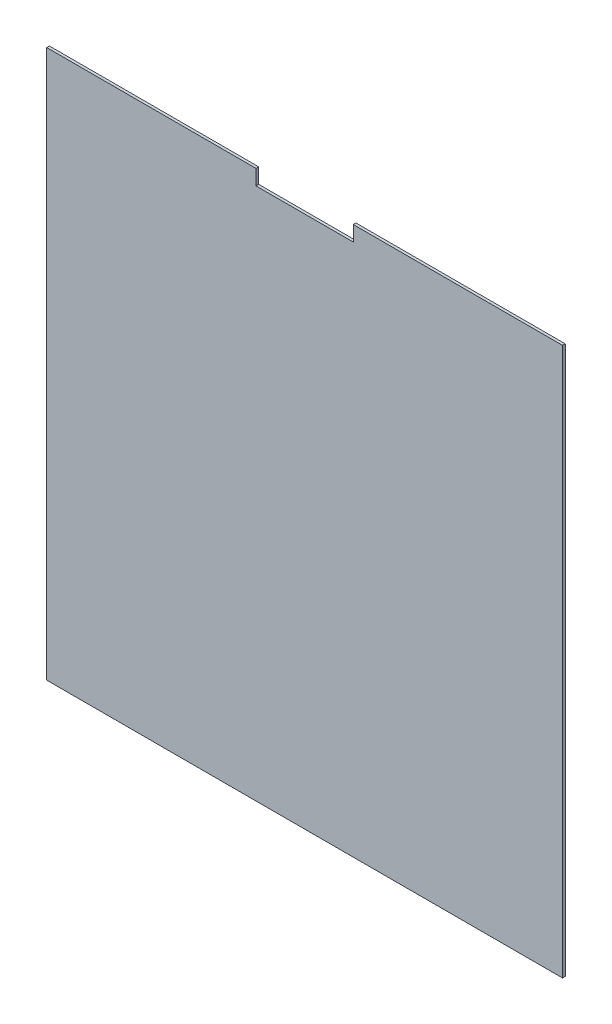
ISO-10303-21;
HEADER;
FILE_DESCRIPTION(('STEP AP214'),'2;1');
FILE_NAME('part.step','',(''),(''),'','','');
FILE_SCHEMA(('AUTOMOTIVE_DESIGN { 1 0 10303 214 1 1 1 1 }'));
ENDSEC;
DATA;
#1=APPLICATION_CONTEXT('core data for automotive mechanical design processes');
#2=APPLICATION_PROTOCOL_DEFINITION('international standard','automotive_design',2000,#1);
#3=PRODUCT_CONTEXT('',#1,'mechanical');
#4=PRODUCT('Part','Part','',(#3));
#5=PRODUCT_RELATED_PRODUCT_CATEGORY('part','',(#4));
#6=PRODUCT_DEFINITION_FORMATION('','',#4);
#7=PRODUCT_DEFINITION_CONTEXT('part definition',#1,'design');
#8=PRODUCT_DEFINITION('design','',#6,#7);
#9=PRODUCT_DEFINITION_SHAPE('','',#8);
#10=(LENGTH_UNIT() NAMED_UNIT(*) SI_UNIT(.MILLI.,.METRE.));
#11=(NAMED_UNIT(*) PLANE_ANGLE_UNIT() SI_UNIT($,.RADIAN.));
#12=(NAMED_UNIT(*) SI_UNIT($,.STERADIAN.) SOLID_ANGLE_UNIT());
#13=UNCERTAINTY_MEASURE_WITH_UNIT(LENGTH_MEASURE(1.E-05),#10,'distance_accuracy_value','');
#14=(GEOMETRIC_REPRESENTATION_CONTEXT(3) GLOBAL_UNCERTAINTY_ASSIGNED_CONTEXT((#13)) GLOBAL_UNIT_ASSIGNED_CONTEXT((#10,
#11,#12)) REPRESENTATION_CONTEXT('',''));
#15=CARTESIAN_POINT('',(0.,0.,0.));
#16=DIRECTION('',(0.,0.,1.));
#17=DIRECTION('',(1.,0.,0.));
#18=AXIS2_PLACEMENT_3D('',#15,#16,#17);
#19=CARTESIAN_POINT('',(22.0000000000001,198.766085175521,3.));
#20=DIRECTION('',(0.,1.,0.));
#21=DIRECTION('',(0.,0.,1.));
#22=AXIS2_PLACEMENT_3D('',#19,#20,#21);
#23=PLANE('',#22);
#24=DIRECTION('',(-1.,0.,0.));
#25=VECTOR('',#24,1.);
#26=CARTESIAN_POINT('',(22.0000000000001,198.766085175521,5.));
#27=LINE('',#26,#25);
#28=CARTESIAN_POINT('',(22.0000000000001,198.766085175521,5.));
#29=VERTEX_POINT('',#28);
#30=CARTESIAN_POINT('',(-50.,198.766085175521,5.));
#31=VERTEX_POINT('',#30);
#32=EDGE_CURVE('E137',#29,#31,#27,.T.);
#33=ORIENTED_EDGE('',*,*,#32,.F.);
#34=DIRECTION('',(0.,0.,1.));
#35=VECTOR('',#34,1.);
#36=CARTESIAN_POINT('',(22.0000000000001,198.766085175521,3.));
#37=LINE('',#36,#35);
#38=CARTESIAN_POINT('',(22.0000000000001,198.766085175521,3.));
#39=VERTEX_POINT('',#38);
#40=EDGE_CURVE('E11',#39,#29,#37,.T.);
#41=ORIENTED_EDGE('',*,*,#40,.F.);
#42=DIRECTION('',(-1.,0.,0.));
#43=VECTOR('',#42,1.);
#44=CARTESIAN_POINT('',(22.0000000000001,198.766085175521,3.));
#45=LINE('',#44,#43);
#46=CARTESIAN_POINT('',(-50.,198.766085175521,3.));
#47=VERTEX_POINT('',#46);
#48=EDGE_CURVE('E154',#39,#47,#45,.T.);
#49=ORIENTED_EDGE('',*,*,#48,.T.);
#50=DIRECTION('',(0.,0.,1.));
#51=VECTOR('',#50,1.);
#52=CARTESIAN_POINT('',(-50.,198.766085175521,3.));
#53=LINE('',#52,#51);
#54=EDGE_CURVE('E44',#47,#31,#53,.T.);
#55=ORIENTED_EDGE('',*,*,#54,.T.);
#56=EDGE_LOOP('',(#33,#41,#49,#55));
#57=FACE_BOUND('',#56,.T.);
#58=ADVANCED_FACE('F41',(#57),#23,.T.);
#59=CARTESIAN_POINT('',(22.0000000000001,210.,3.));
#60=DIRECTION('',(-1.,0.,0.));
#61=DIRECTION('',(0.,0.,1.));
#62=AXIS2_PLACEMENT_3D('',#59,#60,#61);
#63=PLANE('',#62);
#64=DIRECTION('',(0.,-1.,0.));
#65=VECTOR('',#64,1.);
#66=CARTESIAN_POINT('',(22.0000000000001,210.,5.));
#67=LINE('',#66,#65);
#68=CARTESIAN_POINT('',(22.0000000000001,210.,5.));
#69=VERTEX_POINT('',#68);
#70=EDGE_CURVE('E152',#69,#29,#67,.T.);
#71=ORIENTED_EDGE('',*,*,#70,.F.);
#72=DIRECTION('',(0.,0.,1.));
#73=VECTOR('',#72,1.);
#74=CARTESIAN_POINT('',(22.0000000000001,210.,3.));
#75=LINE('',#74,#73);
#76=CARTESIAN_POINT('',(22.0000000000001,210.,3.));
#77=VERTEX_POINT('',#76);
#78=EDGE_CURVE('E49',#77,#69,#75,.T.);
#79=ORIENTED_EDGE('',*,*,#78,.F.);
#80=DIRECTION('',(0.,-1.,0.));
#81=VECTOR('',#80,1.);
#82=CARTESIAN_POINT('',(22.0000000000001,210.,3.));
#83=LINE('',#82,#81);
#84=EDGE_CURVE('E132',#77,#39,#83,.T.);
#85=ORIENTED_EDGE('',*,*,#84,.T.);
#86=ORIENTED_EDGE('',*,*,#40,.T.);
#87=EDGE_LOOP('',(#71,#79,#85,#86));
#88=FACE_BOUND('',#87,.T.);
#89=ADVANCED_FACE('F162',(#88),#63,.T.);
#90=CARTESIAN_POINT('',(177.,210.,3.));
#91=DIRECTION('',(0.,1.,0.));
#92=DIRECTION('',(-1.,0.,0.));
#93=AXIS2_PLACEMENT_3D('',#90,#91,#92);
#94=PLANE('',#93);
#95=DIRECTION('',(-1.,0.,0.));
#96=VECTOR('',#95,1.);
#97=CARTESIAN_POINT('',(177.,210.,5.));
#98=LINE('',#97,#96);
#99=CARTESIAN_POINT('',(177.,210.,5.));
#100=VERTEX_POINT('',#99);
#101=EDGE_CURVE('E128',#100,#69,#98,.T.);
#102=ORIENTED_EDGE('',*,*,#101,.F.);
#103=DIRECTION('',(0.,0.,1.));
#104=VECTOR('',#103,1.);
#105=CARTESIAN_POINT('',(177.,210.,3.));
#106=LINE('',#105,#104);
#107=CARTESIAN_POINT('',(177.,210.,3.));
#108=VERTEX_POINT('',#107);
#109=EDGE_CURVE('E114',#108,#100,#106,.T.);
#110=ORIENTED_EDGE('',*,*,#109,.F.);
#111=DIRECTION('',(-1.,0.,0.));
#112=VECTOR('',#111,1.);
#113=CARTESIAN_POINT('',(177.,210.,3.));
#114=LINE('',#113,#112);
#115=EDGE_CURVE('E120',#108,#77,#114,.T.);
#116=ORIENTED_EDGE('',*,*,#115,.T.);
#117=ORIENTED_EDGE('',*,*,#78,.T.);
#118=EDGE_LOOP('',(#102,#110,#116,#117));
#119=FACE_BOUND('',#118,.T.);
#120=ADVANCED_FACE('F125',(#119),#94,.T.);
#121=CARTESIAN_POINT('',(177.,-225.,3.));
#122=DIRECTION('',(1.,0.,0.));
#123=DIRECTION('',(0.,0.,-1.));
#124=AXIS2_PLACEMENT_3D('',#121,#122,#123);
#125=PLANE('',#124);
#126=DIRECTION('',(0.,0.,1.));
#127=VECTOR('',#126,1.);
#128=CARTESIAN_POINT('',(177.,-195.754616143697,3.));
#129=LINE('',#128,#127);
#130=CARTESIAN_POINT('',(177.,-195.754616143697,3.));
#131=VERTEX_POINT('',#130);
#132=CARTESIAN_POINT('',(177.,-195.754616143697,5.));
#133=VERTEX_POINT('',#132);
#134=EDGE_CURVE('E57',#131,#133,#129,.T.);
#135=ORIENTED_EDGE('',*,*,#134,.F.);
#136=DIRECTION('',(0.,1.,0.));
#137=VECTOR('',#136,1.);
#138=CARTESIAN_POINT('',(177.,-225.,3.));
#139=LINE('',#138,#137);
#140=EDGE_CURVE('E110',#131,#108,#139,.T.);
#141=ORIENTED_EDGE('',*,*,#140,.T.);
#142=ORIENTED_EDGE('',*,*,#109,.T.);
#143=DIRECTION('',(0.,1.,0.));
#144=VECTOR('',#143,1.);
#145=CARTESIAN_POINT('',(177.,-225.,5.));
#146=LINE('',#145,#144);
#147=EDGE_CURVE('E149',#133,#100,#146,.T.);
#148=ORIENTED_EDGE('',*,*,#147,.F.);
#149=EDGE_LOOP('',(#135,#141,#142,#148));
#150=FACE_BOUND('',#149,.T.);
#151=ADVANCED_FACE('F112',(#150),#125,.T.);
#152=CARTESIAN_POINT('',(-205.,210.,3.));
#153=DIRECTION('',(-1.,0.,0.));
#154=DIRECTION('',(0.,-1.,0.));
#155=AXIS2_PLACEMENT_3D('',#152,#153,#154);
#156=PLANE('',#155);
#157=DIRECTION('',(0.,0.,-1.));
#158=VECTOR('',#157,1.);
#159=CARTESIAN_POINT('',(-205.,-195.754616143697,5.));
#160=LINE('',#159,#158);
#161=CARTESIAN_POINT('',(-205.,-195.754616143697,5.));
#162=VERTEX_POINT('',#161);
#163=CARTESIAN_POINT('',(-205.,-195.754616143697,3.));
#164=VERTEX_POINT('',#163);
#165=EDGE_CURVE('E255',#162,#164,#160,.T.);
#166=ORIENTED_EDGE('',*,*,#165,.F.);
#167=DIRECTION('',(0.,-1.,0.));
#168=VECTOR('',#167,1.);
#169=CARTESIAN_POINT('',(-205.,210.,5.));
#170=LINE('',#169,#168);
#171=CARTESIAN_POINT('',(-205.,210.,5.));
#172=VERTEX_POINT('',#171);
#173=EDGE_CURVE('E146',#172,#162,#170,.T.);
#174=ORIENTED_EDGE('',*,*,#173,.F.);
#175=DIRECTION('',(0.,0.,1.));
#176=VECTOR('',#175,1.);
#177=CARTESIAN_POINT('',(-205.,210.,3.));
#178=LINE('',#177,#176);
#179=CARTESIAN_POINT('',(-205.,210.,3.));
#180=VERTEX_POINT('',#179);
#181=EDGE_CURVE('E129',#180,#172,#178,.T.);
#182=ORIENTED_EDGE('',*,*,#181,.F.);
#183=DIRECTION('',(0.,-1.,0.));
#184=VECTOR('',#183,1.);
#185=CARTESIAN_POINT('',(-205.,210.,3.));
#186=LINE('',#185,#184);
#187=EDGE_CURVE('E121',#180,#164,#186,.T.);
#188=ORIENTED_EDGE('',*,*,#187,.T.);
#189=EDGE_LOOP('',(#166,#174,#182,#188));
#190=FACE_BOUND('',#189,.T.);
#191=ADVANCED_FACE('F175',(#190),#156,.T.);
#192=CARTESIAN_POINT('',(-50.,210.,3.));
#193=DIRECTION('',(0.,1.,0.));
#194=DIRECTION('',(-1.,0.,0.));
#195=AXIS2_PLACEMENT_3D('',#192,#193,#194);
#196=PLANE('',#195);
#197=DIRECTION('',(-1.,0.,0.));
#198=VECTOR('',#197,1.);
#199=CARTESIAN_POINT('',(-50.,210.,5.));
#200=LINE('',#199,#198);
#201=CARTESIAN_POINT('',(-50.,210.,5.));
#202=VERTEX_POINT('',#201);
#203=EDGE_CURVE('E143',#202,#172,#200,.T.);
#204=ORIENTED_EDGE('',*,*,#203,.F.);
#205=DIRECTION('',(0.,0.,1.));
#206=VECTOR('',#205,1.);
#207=CARTESIAN_POINT('',(-50.,210.,3.));
#208=LINE('',#207,#206);
#209=CARTESIAN_POINT('',(-50.,210.,3.));
#210=VERTEX_POINT('',#209);
#211=EDGE_CURVE('E157',#210,#202,#208,.T.);
#212=ORIENTED_EDGE('',*,*,#211,.F.);
#213=DIRECTION('',(-1.,0.,0.));
#214=VECTOR('',#213,1.);
#215=CARTESIAN_POINT('',(-50.,210.,3.));
#216=LINE('',#215,#214);
#217=EDGE_CURVE('E265',#210,#180,#216,.T.);
#218=ORIENTED_EDGE('',*,*,#217,.T.);
#219=ORIENTED_EDGE('',*,*,#181,.T.);
#220=EDGE_LOOP('',(#204,#212,#218,#219));
#221=FACE_BOUND('',#220,.T.);
#222=ADVANCED_FACE('F178',(#221),#196,.T.);
#223=CARTESIAN_POINT('',(-50.,198.766085175521,3.));
#224=DIRECTION('',(1.,0.,0.));
#225=DIRECTION('',(0.,0.,-1.));
#226=AXIS2_PLACEMENT_3D('',#223,#224,#225);
#227=PLANE('',#226);
#228=DIRECTION('',(0.,1.,0.));
#229=VECTOR('',#228,1.);
#230=CARTESIAN_POINT('',(-50.,198.766085175521,5.));
#231=LINE('',#230,#229);
#232=EDGE_CURVE('E140',#31,#202,#231,.T.);
#233=ORIENTED_EDGE('',*,*,#232,.F.);
#234=ORIENTED_EDGE('',*,*,#54,.F.);
#235=DIRECTION('',(0.,1.,0.));
#236=VECTOR('',#235,1.);
#237=CARTESIAN_POINT('',(-50.,198.766085175521,3.));
#238=LINE('',#237,#236);
#239=EDGE_CURVE('E263',#47,#210,#238,.T.);
#240=ORIENTED_EDGE('',*,*,#239,.T.);
#241=ORIENTED_EDGE('',*,*,#211,.T.);
#242=EDGE_LOOP('',(#233,#234,#240,#241));
#243=FACE_BOUND('',#242,.T.);
#244=ADVANCED_FACE('F159',(#243),#227,.T.);
#245=CARTESIAN_POINT('',(0.,0.,3.));
#246=DIRECTION('',(0.,0.,-1.));
#247=DIRECTION('',(-1.,0.,0.));
#248=AXIS2_PLACEMENT_3D('',#245,#246,#247);
#249=PLANE('',#248);
#250=DIRECTION('',(1.,0.,0.));
#251=VECTOR('',#250,1.);
#252=CARTESIAN_POINT('',(-205.,-195.754616143697,3.));
#253=LINE('',#252,#251);
#254=EDGE_CURVE('E256',#164,#131,#253,.T.);
#255=ORIENTED_EDGE('',*,*,#254,.F.);
#256=ORIENTED_EDGE('',*,*,#187,.F.);
#257=ORIENTED_EDGE('',*,*,#217,.F.);
#258=ORIENTED_EDGE('',*,*,#239,.F.);
#259=ORIENTED_EDGE('',*,*,#48,.F.);
#260=ORIENTED_EDGE('',*,*,#84,.F.);
#261=ORIENTED_EDGE('',*,*,#115,.F.);
#262=ORIENTED_EDGE('',*,*,#140,.F.);
#263=EDGE_LOOP('',(#255,#256,#257,#258,#259,#260,#261,#262));
#264=FACE_BOUND('',#263,.T.);
#265=ADVANCED_FACE('F131',(#264),#249,.T.);
#266=CARTESIAN_POINT('',(0.,0.,5.));
#267=DIRECTION('',(0.,0.,-1.));
#268=DIRECTION('',(-1.,0.,0.));
#269=AXIS2_PLACEMENT_3D('',#266,#267,#268);
#270=PLANE('',#269);
#271=ORIENTED_EDGE('',*,*,#173,.T.);
#272=DIRECTION('',(-1.,0.,0.));
#273=VECTOR('',#272,1.);
#274=CARTESIAN_POINT('',(177.,-195.754616143697,5.));
#275=LINE('',#274,#273);
#276=EDGE_CURVE('E249',#133,#162,#275,.T.);
#277=ORIENTED_EDGE('',*,*,#276,.F.);
#278=ORIENTED_EDGE('',*,*,#147,.T.);
#279=ORIENTED_EDGE('',*,*,#101,.T.);
#280=ORIENTED_EDGE('',*,*,#70,.T.);
#281=ORIENTED_EDGE('',*,*,#32,.T.);
#282=ORIENTED_EDGE('',*,*,#232,.T.);
#283=ORIENTED_EDGE('',*,*,#203,.T.);
#284=EDGE_LOOP('',(#271,#277,#278,#279,#280,#281,#282,#283));
#285=FACE_BOUND('',#284,.T.);
#286=ADVANCED_FACE('F161',(#285),#270,.F.);
#287=CARTESIAN_POINT('',(-14.,-195.754616143697,230.710638385712));
#288=DIRECTION('',(0.,1.,0.));
#289=DIRECTION('',(0.,0.,1.));
#290=AXIS2_PLACEMENT_3D('',#287,#288,#289);
#291=PLANE('',#290);
#292=ORIENTED_EDGE('',*,*,#134,.T.);
#293=ORIENTED_EDGE('',*,*,#276,.T.);
#294=ORIENTED_EDGE('',*,*,#165,.T.);
#295=ORIENTED_EDGE('',*,*,#254,.T.);
#296=EDGE_LOOP('',(#292,#293,#294,#295));
#297=FACE_BOUND('',#296,.T.);
#298=ADVANCED_FACE('F189',(#297),#291,.F.);
#299=CLOSED_SHELL('',(#58,#89,#120,#151,#191,#222,#244,#265,#286,#298));
#300=MANIFOLD_SOLID_BREP('B2',#299);
#301=ADVANCED_BREP_SHAPE_REPRESENTATION('',(#18,#300),#14);
#302=SHAPE_DEFINITION_REPRESENTATION(#9,#301);
ENDSEC;
END-ISO-10303-21;
